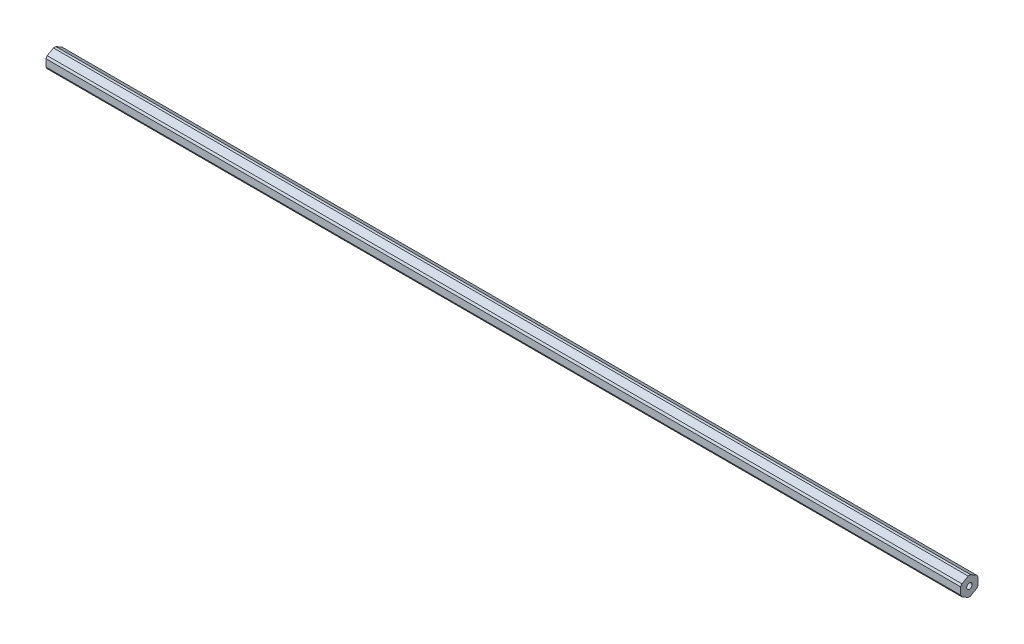
ISO-10303-21;
HEADER;
FILE_DESCRIPTION(('STEP AP214'),'2;1');
FILE_NAME('part.step','',(''),(''),'','','');
FILE_SCHEMA(('AUTOMOTIVE_DESIGN { 1 0 10303 214 1 1 1 1 }'));
ENDSEC;
DATA;
#1=APPLICATION_CONTEXT('core data for automotive mechanical design processes');
#2=APPLICATION_PROTOCOL_DEFINITION('international standard','automotive_design',2000,#1);
#3=PRODUCT_CONTEXT('',#1,'mechanical');
#4=PRODUCT('Part','Part','',(#3));
#5=PRODUCT_RELATED_PRODUCT_CATEGORY('part','',(#4));
#6=PRODUCT_DEFINITION_FORMATION('','',#4);
#7=PRODUCT_DEFINITION_CONTEXT('part definition',#1,'design');
#8=PRODUCT_DEFINITION('design','',#6,#7);
#9=PRODUCT_DEFINITION_SHAPE('','',#8);
#10=(LENGTH_UNIT() NAMED_UNIT(*) SI_UNIT(.MILLI.,.METRE.));
#11=(NAMED_UNIT(*) PLANE_ANGLE_UNIT() SI_UNIT($,.RADIAN.));
#12=(NAMED_UNIT(*) SI_UNIT($,.STERADIAN.) SOLID_ANGLE_UNIT());
#13=UNCERTAINTY_MEASURE_WITH_UNIT(LENGTH_MEASURE(1.E-05),#10,'distance_accuracy_value','');
#14=(GEOMETRIC_REPRESENTATION_CONTEXT(3) GLOBAL_UNCERTAINTY_ASSIGNED_CONTEXT((#13)) GLOBAL_UNIT_ASSIGNED_CONTEXT((#10,
#11,#12)) REPRESENTATION_CONTEXT('',''));
#15=CARTESIAN_POINT('',(0.,0.,0.));
#16=DIRECTION('',(0.,0.,1.));
#17=DIRECTION('',(1.,0.,0.));
#18=AXIS2_PLACEMENT_3D('',#15,#16,#17);
#19=CARTESIAN_POINT('',(342.9,82.4834595723444,423.372267937035));
#20=DIRECTION('',(0.,-0.86602540378444,-0.5));
#21=DIRECTION('',(0.,0.5,-0.86602540378444));
#22=AXIS2_PLACEMENT_3D('',#19,#20,#21);
#23=PLANE('',#22);
#24=DIRECTION('',(-1.,0.,0.));
#25=VECTOR('',#24,1.);
#26=CARTESIAN_POINT('',(342.9,83.8002908295391,421.091449294579));
#27=LINE('',#26,#25);
#28=CARTESIAN_POINT('',(342.9,83.8002908295391,421.091449294578));
#29=VERTEX_POINT('',#28);
#30=CARTESIAN_POINT('',(-330.2,83.8002908295393,421.091449294578));
#31=VERTEX_POINT('',#30);
#32=EDGE_CURVE('E183',#29,#31,#27,.T.);
#33=ORIENTED_EDGE('',*,*,#32,.T.);
#34=DIRECTION('',(0.,0.5,-0.866025403784438));
#35=VECTOR('',#34,1.);
#36=CARTESIAN_POINT('',(-330.2,82.4834595723446,423.372267937035));
#37=LINE('',#36,#35);
#38=CARTESIAN_POINT('',(-330.2,81.1666283151499,425.653086579491));
#39=VERTEX_POINT('',#38);
#40=EDGE_CURVE('E143',#39,#31,#37,.T.);
#41=ORIENTED_EDGE('',*,*,#40,.F.);
#42=DIRECTION('',(-1.,0.,0.));
#43=VECTOR('',#42,1.);
#44=CARTESIAN_POINT('',(342.9,81.1666283151497,425.653086579491));
#45=LINE('',#44,#43);
#46=CARTESIAN_POINT('',(342.9,81.1666283151497,425.653086579491));
#47=VERTEX_POINT('',#46);
#48=EDGE_CURVE('E185',#39,#47,#45,.F.);
#49=ORIENTED_EDGE('',*,*,#48,.T.);
#50=DIRECTION('',(0.,-0.5,0.86602540378444));
#51=VECTOR('',#50,1.);
#52=CARTESIAN_POINT('',(342.9,82.4834595723444,423.372267937035));
#53=LINE('',#52,#51);
#54=EDGE_CURVE('E193',#29,#47,#53,.T.);
#55=ORIENTED_EDGE('',*,*,#54,.F.);
#56=EDGE_LOOP('',(#33,#41,#49,#55));
#57=FACE_BOUND('',#56,.T.);
#58=ADVANCED_FACE('F17',(#57),#23,.F.);
#59=CARTESIAN_POINT('',(342.9,76.9837245723444,426.547541419756));
#60=DIRECTION('',(0.,0.,-1.));
#61=DIRECTION('',(-1.,0.,0.));
#62=AXIS2_PLACEMENT_3D('',#59,#60,#61);
#63=PLANE('',#62);
#64=DIRECTION('',(-1.,0.,0.));
#65=VECTOR('',#64,1.);
#66=CARTESIAN_POINT('',(342.9,79.6173870867338,426.547541419756));
#67=LINE('',#66,#65);
#68=CARTESIAN_POINT('',(342.9,79.6173870867338,426.547541419756));
#69=VERTEX_POINT('',#68);
#70=CARTESIAN_POINT('',(-330.2,79.617387086734,426.547541419756));
#71=VERTEX_POINT('',#70);
#72=EDGE_CURVE('E118',#69,#71,#67,.T.);
#73=ORIENTED_EDGE('',*,*,#72,.T.);
#74=DIRECTION('',(0.,1.,0.));
#75=VECTOR('',#74,1.);
#76=CARTESIAN_POINT('',(-330.2,76.9837245723446,426.547541419756));
#77=LINE('',#76,#75);
#78=CARTESIAN_POINT('',(-330.2,74.3500620579552,426.547541419756));
#79=VERTEX_POINT('',#78);
#80=EDGE_CURVE('E136',#79,#71,#77,.T.);
#81=ORIENTED_EDGE('',*,*,#80,.F.);
#82=DIRECTION('',(-1.,0.,0.));
#83=VECTOR('',#82,1.);
#84=CARTESIAN_POINT('',(342.9,74.350062057955,426.547541419756));
#85=LINE('',#84,#83);
#86=CARTESIAN_POINT('',(342.9,74.350062057955,426.547541419756));
#87=VERTEX_POINT('',#86);
#88=EDGE_CURVE('E179',#79,#87,#85,.F.);
#89=ORIENTED_EDGE('',*,*,#88,.T.);
#90=DIRECTION('',(0.,-1.,0.));
#91=VECTOR('',#90,1.);
#92=CARTESIAN_POINT('',(342.9,76.9837245723444,426.547541419756));
#93=LINE('',#92,#91);
#94=EDGE_CURVE('E197',#69,#87,#93,.T.);
#95=ORIENTED_EDGE('',*,*,#94,.F.);
#96=EDGE_LOOP('',(#73,#81,#89,#95));
#97=FACE_BOUND('',#96,.T.);
#98=ADVANCED_FACE('F262',(#97),#63,.F.);
#99=CARTESIAN_POINT('',(342.9,71.4839895723444,423.372267937035));
#100=DIRECTION('',(0.,0.866025403784438,-0.5));
#101=DIRECTION('',(0.,0.5,0.866025403784438));
#102=AXIS2_PLACEMENT_3D('',#99,#100,#101);
#103=PLANE('',#102);
#104=DIRECTION('',(-1.,0.,0.));
#105=VECTOR('',#104,1.);
#106=CARTESIAN_POINT('',(342.9,72.8008208295391,425.653086579491));
#107=LINE('',#106,#105);
#108=CARTESIAN_POINT('',(342.9,72.8008208295391,425.653086579491));
#109=VERTEX_POINT('',#108);
#110=CARTESIAN_POINT('',(-330.2,72.8008208295393,425.653086579491));
#111=VERTEX_POINT('',#110);
#112=EDGE_CURVE('E119',#109,#111,#107,.T.);
#113=ORIENTED_EDGE('',*,*,#112,.T.);
#114=DIRECTION('',(0.,0.5,0.866025403784438));
#115=VECTOR('',#114,1.);
#116=CARTESIAN_POINT('',(-330.2,71.4839895723446,423.372267937035));
#117=LINE('',#116,#115);
#118=CARTESIAN_POINT('',(-330.2,70.1671583151499,421.091449294578));
#119=VERTEX_POINT('',#118);
#120=EDGE_CURVE('E125',#119,#111,#117,.T.);
#121=ORIENTED_EDGE('',*,*,#120,.F.);
#122=DIRECTION('',(-1.,0.,0.));
#123=VECTOR('',#122,1.);
#124=CARTESIAN_POINT('',(342.9,70.1671583151497,421.091449294578));
#125=LINE('',#124,#123);
#126=CARTESIAN_POINT('',(342.9,70.1671583151497,421.091449294578));
#127=VERTEX_POINT('',#126);
#128=EDGE_CURVE('E106',#119,#127,#125,.F.);
#129=ORIENTED_EDGE('',*,*,#128,.T.);
#130=DIRECTION('',(0.,-0.5,-0.866025403784438));
#131=VECTOR('',#130,1.);
#132=CARTESIAN_POINT('',(342.9,71.4839895723444,423.372267937035));
#133=LINE('',#132,#131);
#134=EDGE_CURVE('E201',#109,#127,#133,.T.);
#135=ORIENTED_EDGE('',*,*,#134,.F.);
#136=EDGE_LOOP('',(#113,#121,#129,#135));
#137=FACE_BOUND('',#136,.T.);
#138=ADVANCED_FACE('F133',(#137),#103,.F.);
#139=CARTESIAN_POINT('',(342.9,71.4839895723444,417.021720971591));
#140=DIRECTION('',(0.,0.866025403784438,0.5));
#141=DIRECTION('',(0.,-0.5,0.866025403784438));
#142=AXIS2_PLACEMENT_3D('',#139,#140,#141);
#143=PLANE('',#142);
#144=DIRECTION('',(-1.,0.,0.));
#145=VECTOR('',#144,1.);
#146=CARTESIAN_POINT('',(342.9,70.1671583151497,419.302539614047));
#147=LINE('',#146,#145);
#148=CARTESIAN_POINT('',(342.9,70.1671583151497,419.302539614047));
#149=VERTEX_POINT('',#148);
#150=CARTESIAN_POINT('',(-330.2,70.1671583151499,419.302539614047));
#151=VERTEX_POINT('',#150);
#152=EDGE_CURVE('E169',#149,#151,#147,.T.);
#153=ORIENTED_EDGE('',*,*,#152,.T.);
#154=DIRECTION('',(0.,-0.5,0.866025403784438));
#155=VECTOR('',#154,1.);
#156=CARTESIAN_POINT('',(-330.2,71.4839895723446,417.021720971591));
#157=LINE('',#156,#155);
#158=CARTESIAN_POINT('',(-330.2,72.8008208295393,414.740902329136));
#159=VERTEX_POINT('',#158);
#160=EDGE_CURVE('E128',#159,#151,#157,.T.);
#161=ORIENTED_EDGE('',*,*,#160,.F.);
#162=DIRECTION('',(-1.,0.,0.));
#163=VECTOR('',#162,1.);
#164=CARTESIAN_POINT('',(342.9,72.8008208295391,414.740902329136));
#165=LINE('',#164,#163);
#166=CARTESIAN_POINT('',(342.9,72.8008208295391,414.740902329136));
#167=VERTEX_POINT('',#166);
#168=EDGE_CURVE('E172',#159,#167,#165,.F.);
#169=ORIENTED_EDGE('',*,*,#168,.T.);
#170=DIRECTION('',(0.,0.5,-0.866025403784438));
#171=VECTOR('',#170,1.);
#172=CARTESIAN_POINT('',(342.9,71.4839895723444,417.021720971591));
#173=LINE('',#172,#171);
#174=EDGE_CURVE('E204',#149,#167,#173,.T.);
#175=ORIENTED_EDGE('',*,*,#174,.F.);
#176=EDGE_LOOP('',(#153,#161,#169,#175));
#177=FACE_BOUND('',#176,.T.);
#178=ADVANCED_FACE('F269',(#177),#143,.F.);
#179=CARTESIAN_POINT('',(342.9,76.9837245723444,413.84644748887));
#180=DIRECTION('',(0.,0.,1.));
#181=DIRECTION('',(1.,0.,0.));
#182=AXIS2_PLACEMENT_3D('',#179,#180,#181);
#183=PLANE('',#182);
#184=DIRECTION('',(-1.,0.,0.));
#185=VECTOR('',#184,1.);
#186=CARTESIAN_POINT('',(342.9,74.350062057955,413.84644748887));
#187=LINE('',#186,#185);
#188=CARTESIAN_POINT('',(342.9,74.350062057955,413.84644748887));
#189=VERTEX_POINT('',#188);
#190=CARTESIAN_POINT('',(-330.2,74.3500620579552,413.84644748887));
#191=VERTEX_POINT('',#190);
#192=EDGE_CURVE('E162',#189,#191,#187,.T.);
#193=ORIENTED_EDGE('',*,*,#192,.T.);
#194=DIRECTION('',(0.,-1.,0.));
#195=VECTOR('',#194,1.);
#196=CARTESIAN_POINT('',(-330.2,76.9837245723446,413.84644748887));
#197=LINE('',#196,#195);
#198=CARTESIAN_POINT('',(-330.2,79.617387086734,413.84644748887));
#199=VERTEX_POINT('',#198);
#200=EDGE_CURVE('E146',#199,#191,#197,.T.);
#201=ORIENTED_EDGE('',*,*,#200,.F.);
#202=DIRECTION('',(-1.,0.,0.));
#203=VECTOR('',#202,1.);
#204=CARTESIAN_POINT('',(342.9,79.6173870867338,413.84644748887));
#205=LINE('',#204,#203);
#206=CARTESIAN_POINT('',(342.9,79.6173870867338,413.84644748887));
#207=VERTEX_POINT('',#206);
#208=EDGE_CURVE('E165',#199,#207,#205,.F.);
#209=ORIENTED_EDGE('',*,*,#208,.T.);
#210=DIRECTION('',(0.,1.,0.));
#211=VECTOR('',#210,1.);
#212=CARTESIAN_POINT('',(342.9,76.9837245723444,413.84644748887));
#213=LINE('',#212,#211);
#214=EDGE_CURVE('E25',#189,#207,#213,.T.);
#215=ORIENTED_EDGE('',*,*,#214,.F.);
#216=EDGE_LOOP('',(#193,#201,#209,#215));
#217=FACE_BOUND('',#216,.T.);
#218=ADVANCED_FACE('F216',(#217),#183,.F.);
#219=CARTESIAN_POINT('',(342.9,82.4834595723444,417.021720971591));
#220=DIRECTION('',(0.,-0.866025403784438,0.5));
#221=DIRECTION('',(0.,-0.5,-0.866025403784438));
#222=AXIS2_PLACEMENT_3D('',#219,#220,#221);
#223=PLANE('',#222);
#224=DIRECTION('',(-1.,0.,0.));
#225=VECTOR('',#224,1.);
#226=CARTESIAN_POINT('',(342.9,81.1666283151497,414.740902329136));
#227=LINE('',#226,#225);
#228=CARTESIAN_POINT('',(342.9,81.1666283151497,414.740902329136));
#229=VERTEX_POINT('',#228);
#230=CARTESIAN_POINT('',(-330.2,81.1666283151499,414.740902329136));
#231=VERTEX_POINT('',#230);
#232=EDGE_CURVE('E40',#229,#231,#227,.T.);
#233=ORIENTED_EDGE('',*,*,#232,.T.);
#234=DIRECTION('',(0.,-0.5,-0.86602540378444));
#235=VECTOR('',#234,1.);
#236=CARTESIAN_POINT('',(-330.2,82.4834595723446,417.021720971591));
#237=LINE('',#236,#235);
#238=CARTESIAN_POINT('',(-330.2,83.8002908295393,419.302539614047));
#239=VERTEX_POINT('',#238);
#240=EDGE_CURVE('E226',#239,#231,#237,.T.);
#241=ORIENTED_EDGE('',*,*,#240,.F.);
#242=DIRECTION('',(-1.,0.,0.));
#243=VECTOR('',#242,1.);
#244=CARTESIAN_POINT('',(342.9,83.8002908295391,419.302539614047));
#245=LINE('',#244,#243);
#246=CARTESIAN_POINT('',(342.9,83.8002908295391,419.302539614047));
#247=VERTEX_POINT('',#246);
#248=EDGE_CURVE('E159',#239,#247,#245,.F.);
#249=ORIENTED_EDGE('',*,*,#248,.T.);
#250=DIRECTION('',(0.,0.5,0.866025403784438));
#251=VECTOR('',#250,1.);
#252=CARTESIAN_POINT('',(342.9,82.4834595723444,417.021720971591));
#253=LINE('',#252,#251);
#254=EDGE_CURVE('E11',#229,#247,#253,.T.);
#255=ORIENTED_EDGE('',*,*,#254,.F.);
#256=EDGE_LOOP('',(#233,#241,#249,#255));
#257=FACE_BOUND('',#256,.T.);
#258=ADVANCED_FACE('F255',(#257),#223,.F.);
#259=CARTESIAN_POINT('',(342.9,76.9837245723444,420.196994454313));
#260=DIRECTION('',(1.,0.,0.));
#261=DIRECTION('',(0.,1.,0.));
#262=AXIS2_PLACEMENT_3D('',#259,#260,#261);
#263=PLANE('',#262);
#264=CARTESIAN_POINT('',(342.9,76.9837245723444,420.196994454313));
#265=DIRECTION('',(1.,0.,0.));
#266=DIRECTION('',(0.,1.,0.));
#267=AXIS2_PLACEMENT_3D('',#264,#265,#266);
#268=CIRCLE('',#267,2.);
#269=CARTESIAN_POINT('',(342.9,78.9837245723444,420.196994454313));
#270=VERTEX_POINT('',#269);
#271=EDGE_CURVE('E189',#270,#270,#268,.T.);
#272=ORIENTED_EDGE('',*,*,#271,.F.);
#273=EDGE_LOOP('',(#272));
#274=FACE_BOUND('',#273,.T.);
#275=ORIENTED_EDGE('',*,*,#54,.T.);
#276=CARTESIAN_POINT('',(342.9,76.9837245723444,420.196994454313));
#277=DIRECTION('',(1.,0.,0.));
#278=DIRECTION('',(0.,1.,0.));
#279=AXIS2_PLACEMENT_3D('',#276,#277,#278);
#280=CIRCLE('',#279,6.875);
#281=EDGE_CURVE('E156',#47,#69,#280,.T.);
#282=ORIENTED_EDGE('',*,*,#281,.T.);
#283=ORIENTED_EDGE('',*,*,#94,.T.);
#284=EDGE_CURVE('E260',#87,#109,#280,.T.);
#285=ORIENTED_EDGE('',*,*,#284,.T.);
#286=ORIENTED_EDGE('',*,*,#134,.T.);
#287=EDGE_CURVE('E112',#127,#149,#280,.T.);
#288=ORIENTED_EDGE('',*,*,#287,.T.);
#289=ORIENTED_EDGE('',*,*,#174,.T.);
#290=EDGE_CURVE('E214',#167,#189,#280,.T.);
#291=ORIENTED_EDGE('',*,*,#290,.T.);
#292=ORIENTED_EDGE('',*,*,#214,.T.);
#293=EDGE_CURVE('E155',#207,#229,#280,.T.);
#294=ORIENTED_EDGE('',*,*,#293,.T.);
#295=ORIENTED_EDGE('',*,*,#254,.T.);
#296=EDGE_CURVE('E32',#247,#29,#280,.T.);
#297=ORIENTED_EDGE('',*,*,#296,.T.);
#298=EDGE_LOOP('',(#275,#282,#283,#285,#286,#288,#289,#291,#292,#294,#295,#297));
#299=FACE_BOUND('',#298,.T.);
#300=ADVANCED_FACE('F212',(#274,#299),#263,.T.);
#301=CARTESIAN_POINT('',(342.9,76.9837245723444,420.196994454313));
#302=DIRECTION('',(-1.,0.,0.));
#303=DIRECTION('',(0.,-1.,0.));
#304=AXIS2_PLACEMENT_3D('',#301,#302,#303);
#305=CYLINDRICAL_SURFACE('',#304,2.);
#306=ORIENTED_EDGE('',*,*,#271,.T.);
#307=EDGE_LOOP('',(#306));
#308=FACE_BOUND('',#307,.T.);
#309=CARTESIAN_POINT('',(-330.2,76.9837245723446,420.196994454313));
#310=DIRECTION('',(-1.,0.,0.));
#311=DIRECTION('',(0.,-1.,0.));
#312=AXIS2_PLACEMENT_3D('',#309,#310,#311);
#313=CIRCLE('',#312,2.);
#314=CARTESIAN_POINT('',(-330.2,74.9837245723446,420.196994454313));
#315=VERTEX_POINT('',#314);
#316=EDGE_CURVE('E234',#315,#315,#313,.T.);
#317=ORIENTED_EDGE('',*,*,#316,.T.);
#318=EDGE_LOOP('',(#317));
#319=FACE_BOUND('',#318,.T.);
#320=ADVANCED_FACE('F282',(#308,#319),#305,.F.);
#321=CARTESIAN_POINT('',(342.9,76.9837245723444,420.196994454313));
#322=DIRECTION('',(-1.,0.,0.));
#323=DIRECTION('',(0.,-1.,0.));
#324=AXIS2_PLACEMENT_3D('',#321,#322,#323);
#325=CYLINDRICAL_SURFACE('',#324,6.875);
#326=ORIENTED_EDGE('',*,*,#208,.F.);
#327=CARTESIAN_POINT('',(-330.2,76.9837245723446,420.196994454313));
#328=DIRECTION('',(-1.,0.,0.));
#329=DIRECTION('',(0.,-1.,0.));
#330=AXIS2_PLACEMENT_3D('',#327,#328,#329);
#331=CIRCLE('',#330,6.875);
#332=EDGE_CURVE('E222',#231,#199,#331,.T.);
#333=ORIENTED_EDGE('',*,*,#332,.F.);
#334=ORIENTED_EDGE('',*,*,#232,.F.);
#335=ORIENTED_EDGE('',*,*,#293,.F.);
#336=EDGE_LOOP('',(#326,#333,#334,#335));
#337=FACE_BOUND('',#336,.T.);
#338=ADVANCED_FACE('F221',(#337),#325,.T.);
#339=ORIENTED_EDGE('',*,*,#296,.F.);
#340=ORIENTED_EDGE('',*,*,#248,.F.);
#341=EDGE_CURVE('E228',#31,#239,#331,.T.);
#342=ORIENTED_EDGE('',*,*,#341,.F.);
#343=ORIENTED_EDGE('',*,*,#32,.F.);
#344=EDGE_LOOP('',(#339,#340,#342,#343));
#345=FACE_BOUND('',#344,.T.);
#346=ADVANCED_FACE('F253',(#345),#325,.T.);
#347=ORIENTED_EDGE('',*,*,#168,.F.);
#348=EDGE_CURVE('E130',#191,#159,#331,.T.);
#349=ORIENTED_EDGE('',*,*,#348,.F.);
#350=ORIENTED_EDGE('',*,*,#192,.F.);
#351=ORIENTED_EDGE('',*,*,#290,.F.);
#352=EDGE_LOOP('',(#347,#349,#350,#351));
#353=FACE_BOUND('',#352,.T.);
#354=ADVANCED_FACE('F271',(#353),#325,.T.);
#355=ORIENTED_EDGE('',*,*,#128,.F.);
#356=EDGE_CURVE('E109',#151,#119,#331,.T.);
#357=ORIENTED_EDGE('',*,*,#356,.F.);
#358=ORIENTED_EDGE('',*,*,#152,.F.);
#359=ORIENTED_EDGE('',*,*,#287,.F.);
#360=EDGE_LOOP('',(#355,#357,#358,#359));
#361=FACE_BOUND('',#360,.T.);
#362=ADVANCED_FACE('F108',(#361),#325,.T.);
#363=ORIENTED_EDGE('',*,*,#88,.F.);
#364=EDGE_CURVE('E132',#111,#79,#331,.T.);
#365=ORIENTED_EDGE('',*,*,#364,.F.);
#366=ORIENTED_EDGE('',*,*,#112,.F.);
#367=ORIENTED_EDGE('',*,*,#284,.F.);
#368=EDGE_LOOP('',(#363,#365,#366,#367));
#369=FACE_BOUND('',#368,.T.);
#370=ADVANCED_FACE('F264',(#369),#325,.T.);
#371=ORIENTED_EDGE('',*,*,#48,.F.);
#372=EDGE_CURVE('E231',#71,#39,#331,.T.);
#373=ORIENTED_EDGE('',*,*,#372,.F.);
#374=ORIENTED_EDGE('',*,*,#72,.F.);
#375=ORIENTED_EDGE('',*,*,#281,.F.);
#376=EDGE_LOOP('',(#371,#373,#374,#375));
#377=FACE_BOUND('',#376,.T.);
#378=ADVANCED_FACE('F278',(#377),#325,.T.);
#379=CARTESIAN_POINT('',(-330.2,76.9837245723446,420.196994454313));
#380=DIRECTION('',(-1.,0.,0.));
#381=DIRECTION('',(0.,1.,0.));
#382=AXIS2_PLACEMENT_3D('',#379,#380,#381);
#383=PLANE('',#382);
#384=ORIENTED_EDGE('',*,*,#316,.F.);
#385=EDGE_LOOP('',(#384));
#386=FACE_BOUND('',#385,.T.);
#387=ORIENTED_EDGE('',*,*,#120,.T.);
#388=ORIENTED_EDGE('',*,*,#364,.T.);
#389=ORIENTED_EDGE('',*,*,#80,.T.);
#390=ORIENTED_EDGE('',*,*,#372,.T.);
#391=ORIENTED_EDGE('',*,*,#40,.T.);
#392=ORIENTED_EDGE('',*,*,#341,.T.);
#393=ORIENTED_EDGE('',*,*,#240,.T.);
#394=ORIENTED_EDGE('',*,*,#332,.T.);
#395=ORIENTED_EDGE('',*,*,#200,.T.);
#396=ORIENTED_EDGE('',*,*,#348,.T.);
#397=ORIENTED_EDGE('',*,*,#160,.T.);
#398=ORIENTED_EDGE('',*,*,#356,.T.);
#399=EDGE_LOOP('',(#387,#388,#389,#390,#391,#392,#393,#394,#395,#396,#397,#398));
#400=FACE_BOUND('',#399,.T.);
#401=ADVANCED_FACE('F123',(#386,#400),#383,.T.);
#402=CLOSED_SHELL('',(#58,#98,#138,#178,#218,#258,#300,#320,#338,#346,#354,#362,#370,#378,#401));
#403=MANIFOLD_SOLID_BREP('B1',#402);
#404=ADVANCED_BREP_SHAPE_REPRESENTATION('',(#18,#403),#14);
#405=SHAPE_DEFINITION_REPRESENTATION(#9,#404);
ENDSEC;
END-ISO-10303-21;
